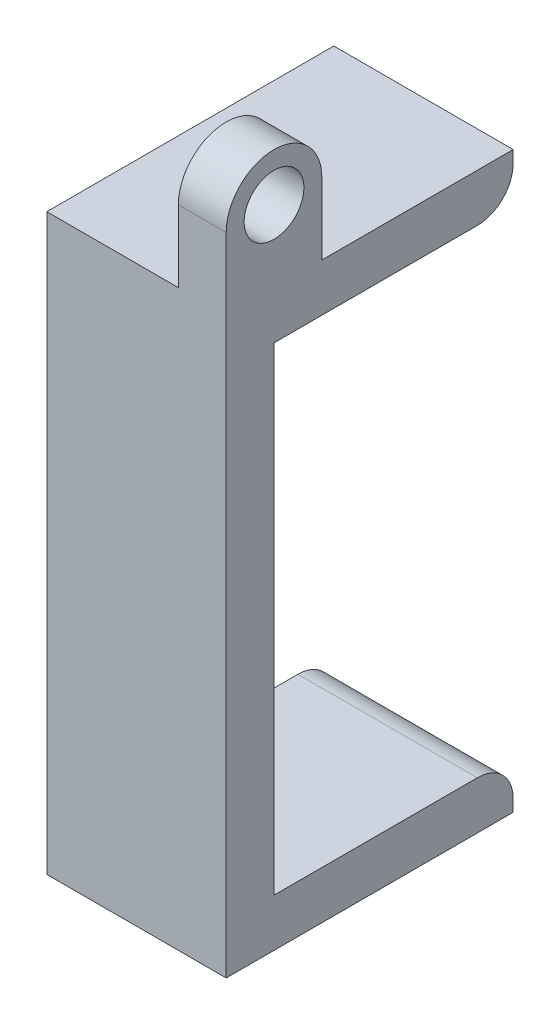
ISO-10303-21;
HEADER;
FILE_DESCRIPTION(('STEP AP214'),'2;1');
FILE_NAME('part.step','',(''),(''),'','','');
FILE_SCHEMA(('AUTOMOTIVE_DESIGN { 1 0 10303 214 1 1 1 1 }'));
ENDSEC;
DATA;
#1=APPLICATION_CONTEXT('core data for automotive mechanical design processes');
#2=APPLICATION_PROTOCOL_DEFINITION('international standard','automotive_design',2000,#1);
#3=PRODUCT_CONTEXT('',#1,'mechanical');
#4=PRODUCT('Part','Part','',(#3));
#5=PRODUCT_RELATED_PRODUCT_CATEGORY('part','',(#4));
#6=PRODUCT_DEFINITION_FORMATION('','',#4);
#7=PRODUCT_DEFINITION_CONTEXT('part definition',#1,'design');
#8=PRODUCT_DEFINITION('design','',#6,#7);
#9=PRODUCT_DEFINITION_SHAPE('','',#8);
#10=(LENGTH_UNIT() NAMED_UNIT(*) SI_UNIT(.MILLI.,.METRE.));
#11=(NAMED_UNIT(*) PLANE_ANGLE_UNIT() SI_UNIT($,.RADIAN.));
#12=(NAMED_UNIT(*) SI_UNIT($,.STERADIAN.) SOLID_ANGLE_UNIT());
#13=UNCERTAINTY_MEASURE_WITH_UNIT(LENGTH_MEASURE(1.E-05),#10,'distance_accuracy_value','');
#14=(GEOMETRIC_REPRESENTATION_CONTEXT(3) GLOBAL_UNCERTAINTY_ASSIGNED_CONTEXT((#13)) GLOBAL_UNIT_ASSIGNED_CONTEXT((#10,
#11,#12)) REPRESENTATION_CONTEXT('',''));
#15=CARTESIAN_POINT('',(0.,0.,0.));
#16=DIRECTION('',(0.,0.,1.));
#17=DIRECTION('',(1.,0.,0.));
#18=AXIS2_PLACEMENT_3D('',#15,#16,#17);
#19=CARTESIAN_POINT('',(-11.,-4.99999999999998,-20.));
#20=DIRECTION('',(0.,0.,-1.));
#21=DIRECTION('',(0.,1.,0.));
#22=AXIS2_PLACEMENT_3D('',#19,#20,#21);
#23=PLANE('',#22);
#24=DIRECTION('',(0.,1.,0.));
#25=VECTOR('',#24,1.);
#26=CARTESIAN_POINT('',(-11.,-4.99999999999998,-20.));
#27=LINE('',#26,#25);
#28=CARTESIAN_POINT('',(-11.,-53.,-20.));
#29=VERTEX_POINT('',#28);
#30=CARTESIAN_POINT('',(-11.,-52.,-20.));
#31=VERTEX_POINT('',#30);
#32=EDGE_CURVE('E163',#29,#31,#27,.T.);
#33=ORIENTED_EDGE('',*,*,#32,.T.);
#34=DIRECTION('',(-1.,0.,0.));
#35=VECTOR('',#34,1.);
#36=CARTESIAN_POINT('',(4.,-52.,-20.));
#37=LINE('',#36,#35);
#38=CARTESIAN_POINT('',(4.,-52.,-20.));
#39=VERTEX_POINT('',#38);
#40=EDGE_CURVE('E226',#31,#39,#37,.F.);
#41=ORIENTED_EDGE('',*,*,#40,.T.);
#42=DIRECTION('',(0.,1.,0.));
#43=VECTOR('',#42,1.);
#44=CARTESIAN_POINT('',(4.,-4.99999999999998,-20.));
#45=LINE('',#44,#43);
#46=CARTESIAN_POINT('',(4.,-53.,-20.));
#47=VERTEX_POINT('',#46);
#48=EDGE_CURVE('E175',#47,#39,#45,.T.);
#49=ORIENTED_EDGE('',*,*,#48,.F.);
#50=DIRECTION('',(1.,0.,0.));
#51=VECTOR('',#50,1.);
#52=CARTESIAN_POINT('',(-11.,-53.,-20.));
#53=LINE('',#52,#51);
#54=EDGE_CURVE('E247',#29,#47,#53,.T.);
#55=ORIENTED_EDGE('',*,*,#54,.F.);
#56=EDGE_LOOP('',(#33,#41,#49,#55));
#57=FACE_BOUND('',#56,.T.);
#58=ADVANCED_FACE('F33',(#57),#23,.T.);
#59=CARTESIAN_POINT('',(4.,1.00000000000002,0.));
#60=DIRECTION('',(-1.,0.,0.));
#61=DIRECTION('',(0.,0.,1.));
#62=AXIS2_PLACEMENT_3D('',#59,#60,#61);
#63=CYLINDRICAL_SURFACE('',#62,4.);
#64=CARTESIAN_POINT('',(0.,1.00000000000002,0.));
#65=DIRECTION('',(1.,0.,0.));
#66=DIRECTION('',(0.,0.,-1.));
#67=AXIS2_PLACEMENT_3D('',#64,#65,#66);
#68=CIRCLE('',#67,4.);
#69=CARTESIAN_POINT('',(0.,1.00000000000002,-3.99999999999999));
#70=VERTEX_POINT('',#69);
#71=CARTESIAN_POINT('',(0.,1.00000000000002,4.00000000000001));
#72=VERTEX_POINT('',#71);
#73=EDGE_CURVE('E202',#70,#72,#68,.T.);
#74=ORIENTED_EDGE('',*,*,#73,.T.);
#75=DIRECTION('',(-1.,0.,0.));
#76=VECTOR('',#75,1.);
#77=CARTESIAN_POINT('',(4.,1.00000000000002,4.00000000000001));
#78=LINE('',#77,#76);
#79=CARTESIAN_POINT('',(4.,1.00000000000002,4.00000000000001));
#80=VERTEX_POINT('',#79);
#81=EDGE_CURVE('E222',#80,#72,#78,.T.);
#82=ORIENTED_EDGE('',*,*,#81,.F.);
#83=CARTESIAN_POINT('',(4.,1.00000000000002,0.));
#84=DIRECTION('',(1.,0.,0.));
#85=DIRECTION('',(0.,0.,-1.));
#86=AXIS2_PLACEMENT_3D('',#83,#84,#85);
#87=CIRCLE('',#86,4.);
#88=CARTESIAN_POINT('',(4.,1.00000000000002,-3.99999999999999));
#89=VERTEX_POINT('',#88);
#90=EDGE_CURVE('E193',#89,#80,#87,.T.);
#91=ORIENTED_EDGE('',*,*,#90,.F.);
#92=DIRECTION('',(-1.,0.,0.));
#93=VECTOR('',#92,1.);
#94=CARTESIAN_POINT('',(4.,1.00000000000002,-3.99999999999999));
#95=LINE('',#94,#93);
#96=EDGE_CURVE('E267',#89,#70,#95,.T.);
#97=ORIENTED_EDGE('',*,*,#96,.T.);
#98=EDGE_LOOP('',(#74,#82,#91,#97));
#99=FACE_BOUND('',#98,.T.);
#100=ADVANCED_FACE('F262',(#99),#63,.T.);
#101=CARTESIAN_POINT('',(4.,0.,4.00000000000001));
#102=DIRECTION('',(0.,0.,1.));
#103=DIRECTION('',(1.,0.,0.));
#104=AXIS2_PLACEMENT_3D('',#101,#102,#103);
#105=PLANE('',#104);
#106=DIRECTION('',(0.,1.,0.));
#107=VECTOR('',#106,1.);
#108=CARTESIAN_POINT('',(0.,0.,4.00000000000001));
#109=LINE('',#108,#107);
#110=CARTESIAN_POINT('',(0.,-4.99999999999998,4.00000000000001));
#111=VERTEX_POINT('',#110);
#112=EDGE_CURVE('E205',#111,#72,#109,.T.);
#113=ORIENTED_EDGE('',*,*,#112,.F.);
#114=DIRECTION('',(1.,0.,0.));
#115=VECTOR('',#114,1.);
#116=CARTESIAN_POINT('',(-11.,-4.99999999999998,4.00000000000001));
#117=LINE('',#116,#115);
#118=CARTESIAN_POINT('',(-11.,-4.99999999999998,4.00000000000001));
#119=VERTEX_POINT('',#118);
#120=EDGE_CURVE('E186',#119,#111,#117,.T.);
#121=ORIENTED_EDGE('',*,*,#120,.F.);
#122=DIRECTION('',(0.,-1.,0.));
#123=VECTOR('',#122,1.);
#124=CARTESIAN_POINT('',(-11.,-4.99999999999998,4.00000000000001));
#125=LINE('',#124,#123);
#126=CARTESIAN_POINT('',(-11.,-53.,4.));
#127=VERTEX_POINT('',#126);
#128=EDGE_CURVE('E155',#119,#127,#125,.T.);
#129=ORIENTED_EDGE('',*,*,#128,.T.);
#130=DIRECTION('',(1.,0.,0.));
#131=VECTOR('',#130,1.);
#132=CARTESIAN_POINT('',(-11.,-53.,4.));
#133=LINE('',#132,#131);
#134=CARTESIAN_POINT('',(4.,-53.,4.));
#135=VERTEX_POINT('',#134);
#136=EDGE_CURVE('E169',#127,#135,#133,.T.);
#137=ORIENTED_EDGE('',*,*,#136,.T.);
#138=DIRECTION('',(0.,1.,0.));
#139=VECTOR('',#138,1.);
#140=CARTESIAN_POINT('',(4.,0.,4.00000000000001));
#141=LINE('',#140,#139);
#142=EDGE_CURVE('E196',#135,#80,#141,.T.);
#143=ORIENTED_EDGE('',*,*,#142,.T.);
#144=ORIENTED_EDGE('',*,*,#81,.T.);
#145=EDGE_LOOP('',(#113,#121,#129,#137,#143,#144));
#146=FACE_BOUND('',#145,.T.);
#147=ADVANCED_FACE('F254',(#146),#105,.T.);
#148=CARTESIAN_POINT('',(4.,1.00000000000002,0.));
#149=DIRECTION('',(-1.,0.,0.));
#150=DIRECTION('',(0.,0.,1.));
#151=AXIS2_PLACEMENT_3D('',#148,#149,#150);
#152=CYLINDRICAL_SURFACE('',#151,2.5);
#153=CARTESIAN_POINT('',(4.,1.00000000000002,0.));
#154=DIRECTION('',(1.,0.,0.));
#155=DIRECTION('',(0.,0.,-1.));
#156=AXIS2_PLACEMENT_3D('',#153,#154,#155);
#157=CIRCLE('',#156,2.5);
#158=CARTESIAN_POINT('',(4.,1.00000000000002,-2.49999999999999));
#159=VERTEX_POINT('',#158);
#160=EDGE_CURVE('E190',#159,#159,#157,.T.);
#161=ORIENTED_EDGE('',*,*,#160,.T.);
#162=EDGE_LOOP('',(#161));
#163=FACE_BOUND('',#162,.T.);
#164=CARTESIAN_POINT('',(0.,1.00000000000002,0.));
#165=DIRECTION('',(1.,0.,0.));
#166=DIRECTION('',(0.,0.,-1.));
#167=AXIS2_PLACEMENT_3D('',#164,#165,#166);
#168=CIRCLE('',#167,2.5);
#169=CARTESIAN_POINT('',(0.,1.00000000000002,-2.49999999999999));
#170=VERTEX_POINT('',#169);
#171=EDGE_CURVE('E188',#170,#170,#168,.T.);
#172=ORIENTED_EDGE('',*,*,#171,.F.);
#173=EDGE_LOOP('',(#172));
#174=FACE_BOUND('',#173,.T.);
#175=ADVANCED_FACE('F277',(#163,#174),#152,.F.);
#176=CARTESIAN_POINT('',(4.,0.,-3.99999999999999));
#177=DIRECTION('',(0.,0.,1.));
#178=DIRECTION('',(1.,0.,0.));
#179=AXIS2_PLACEMENT_3D('',#176,#177,#178);
#180=PLANE('',#179);
#181=DIRECTION('',(0.,1.,0.));
#182=VECTOR('',#181,1.);
#183=CARTESIAN_POINT('',(0.,0.,-3.99999999999999));
#184=LINE('',#183,#182);
#185=CARTESIAN_POINT('',(0.,-4.99999999999998,-3.99999999999999));
#186=VERTEX_POINT('',#185);
#187=EDGE_CURVE('E194',#186,#70,#184,.T.);
#188=ORIENTED_EDGE('',*,*,#187,.T.);
#189=ORIENTED_EDGE('',*,*,#96,.F.);
#190=DIRECTION('',(0.,1.,0.));
#191=VECTOR('',#190,1.);
#192=CARTESIAN_POINT('',(4.,0.,-3.99999999999999));
#193=LINE('',#192,#191);
#194=CARTESIAN_POINT('',(4.,-4.99999999999998,-3.99999999999999));
#195=VERTEX_POINT('',#194);
#196=EDGE_CURVE('E199',#195,#89,#193,.T.);
#197=ORIENTED_EDGE('',*,*,#196,.F.);
#198=DIRECTION('',(-1.,0.,0.));
#199=VECTOR('',#198,1.);
#200=CARTESIAN_POINT('',(4.,-4.99999999999998,-3.99999999999999));
#201=LINE('',#200,#199);
#202=EDGE_CURVE('E264',#195,#186,#201,.T.);
#203=ORIENTED_EDGE('',*,*,#202,.T.);
#204=EDGE_LOOP('',(#188,#189,#197,#203));
#205=FACE_BOUND('',#204,.T.);
#206=ADVANCED_FACE('F275',(#205),#180,.F.);
#207=CARTESIAN_POINT('',(4.,0.,0.));
#208=DIRECTION('',(1.,0.,0.));
#209=DIRECTION('',(0.,0.,-1.));
#210=AXIS2_PLACEMENT_3D('',#207,#208,#209);
#211=PLANE('',#210);
#212=ORIENTED_EDGE('',*,*,#48,.T.);
#213=CARTESIAN_POINT('',(4.,-52.,-17.));
#214=DIRECTION('',(1.,0.,0.));
#215=DIRECTION('',(0.,0.,-1.));
#216=AXIS2_PLACEMENT_3D('',#213,#214,#215);
#217=CIRCLE('',#216,3.);
#218=CARTESIAN_POINT('',(4.,-49.,-17.));
#219=VERTEX_POINT('',#218);
#220=EDGE_CURVE('E133',#39,#219,#217,.T.);
#221=ORIENTED_EDGE('',*,*,#220,.T.);
#222=DIRECTION('',(0.,0.,1.));
#223=VECTOR('',#222,1.);
#224=CARTESIAN_POINT('',(4.,-49.,-20.));
#225=LINE('',#224,#223);
#226=CARTESIAN_POINT('',(4.,-49.,0.));
#227=VERTEX_POINT('',#226);
#228=EDGE_CURVE('E126',#219,#227,#225,.T.);
#229=ORIENTED_EDGE('',*,*,#228,.T.);
#230=DIRECTION('',(0.,1.,0.));
#231=VECTOR('',#230,1.);
#232=CARTESIAN_POINT('',(4.,-8.99999999999998,0.));
#233=LINE('',#232,#231);
#234=CARTESIAN_POINT('',(4.,-8.99999999999998,0.));
#235=VERTEX_POINT('',#234);
#236=EDGE_CURVE('E131',#227,#235,#233,.T.);
#237=ORIENTED_EDGE('',*,*,#236,.T.);
#238=DIRECTION('',(0.,0.,-1.));
#239=VECTOR('',#238,1.);
#240=CARTESIAN_POINT('',(4.,-8.99999999999998,-20.));
#241=LINE('',#240,#239);
#242=CARTESIAN_POINT('',(4.,-8.99999999999998,-17.));
#243=VERTEX_POINT('',#242);
#244=EDGE_CURVE('E174',#235,#243,#241,.T.);
#245=ORIENTED_EDGE('',*,*,#244,.T.);
#246=CARTESIAN_POINT('',(4.,-5.99999999999998,-17.));
#247=DIRECTION('',(1.,0.,0.));
#248=DIRECTION('',(0.,0.,-1.));
#249=AXIS2_PLACEMENT_3D('',#246,#247,#248);
#250=CIRCLE('',#249,3.);
#251=CARTESIAN_POINT('',(4.,-5.99999999999998,-20.));
#252=VERTEX_POINT('',#251);
#253=EDGE_CURVE('E48',#243,#252,#250,.T.);
#254=ORIENTED_EDGE('',*,*,#253,.T.);
#255=CARTESIAN_POINT('',(4.,-4.99999999999998,-20.));
#256=VERTEX_POINT('',#255);
#257=EDGE_CURVE('E173',#252,#256,#45,.T.);
#258=ORIENTED_EDGE('',*,*,#257,.T.);
#259=DIRECTION('',(0.,0.,1.));
#260=VECTOR('',#259,1.);
#261=CARTESIAN_POINT('',(4.,-4.99999999999998,4.00000000000001));
#262=LINE('',#261,#260);
#263=EDGE_CURVE('E159',#256,#195,#262,.T.);
#264=ORIENTED_EDGE('',*,*,#263,.T.);
#265=ORIENTED_EDGE('',*,*,#196,.T.);
#266=ORIENTED_EDGE('',*,*,#90,.T.);
#267=ORIENTED_EDGE('',*,*,#142,.F.);
#268=DIRECTION('',(0.,0.,-1.));
#269=VECTOR('',#268,1.);
#270=CARTESIAN_POINT('',(4.,-53.,4.));
#271=LINE('',#270,#269);
#272=EDGE_CURVE('E170',#135,#47,#271,.T.);
#273=ORIENTED_EDGE('',*,*,#272,.T.);
#274=EDGE_LOOP('',(#212,#221,#229,#237,#245,#254,#258,#264,#265,#266,#267,#273));
#275=FACE_BOUND('',#274,.T.);
#276=ORIENTED_EDGE('',*,*,#160,.F.);
#277=EDGE_LOOP('',(#276));
#278=FACE_BOUND('',#277,.T.);
#279=ADVANCED_FACE('F129',(#275,#278),#211,.T.);
#280=CARTESIAN_POINT('',(0.,0.,0.));
#281=DIRECTION('',(1.,0.,0.));
#282=DIRECTION('',(0.,0.,-1.));
#283=AXIS2_PLACEMENT_3D('',#280,#281,#282);
#284=PLANE('',#283);
#285=ORIENTED_EDGE('',*,*,#171,.T.);
#286=EDGE_LOOP('',(#285));
#287=FACE_BOUND('',#286,.T.);
#288=ORIENTED_EDGE('',*,*,#73,.F.);
#289=ORIENTED_EDGE('',*,*,#187,.F.);
#290=DIRECTION('',(0.,0.,-1.));
#291=VECTOR('',#290,1.);
#292=CARTESIAN_POINT('',(0.,-4.99999999999998,0.));
#293=LINE('',#292,#291);
#294=EDGE_CURVE('E210',#111,#186,#293,.T.);
#295=ORIENTED_EDGE('',*,*,#294,.F.);
#296=ORIENTED_EDGE('',*,*,#112,.T.);
#297=EDGE_LOOP('',(#288,#289,#295,#296));
#298=FACE_BOUND('',#297,.T.);
#299=ADVANCED_FACE('F274',(#287,#298),#284,.F.);
#300=CARTESIAN_POINT('',(-11.,-4.99999999999998,4.00000000000001));
#301=DIRECTION('',(0.,1.,0.));
#302=DIRECTION('',(0.,0.,1.));
#303=AXIS2_PLACEMENT_3D('',#300,#301,#302);
#304=PLANE('',#303);
#305=ORIENTED_EDGE('',*,*,#120,.T.);
#306=ORIENTED_EDGE('',*,*,#294,.T.);
#307=ORIENTED_EDGE('',*,*,#202,.F.);
#308=ORIENTED_EDGE('',*,*,#263,.F.);
#309=DIRECTION('',(1.,0.,0.));
#310=VECTOR('',#309,1.);
#311=CARTESIAN_POINT('',(-11.,-4.99999999999998,-20.));
#312=LINE('',#311,#310);
#313=CARTESIAN_POINT('',(-11.,-4.99999999999998,-20.));
#314=VERTEX_POINT('',#313);
#315=EDGE_CURVE('E189',#314,#256,#312,.T.);
#316=ORIENTED_EDGE('',*,*,#315,.F.);
#317=DIRECTION('',(0.,0.,1.));
#318=VECTOR('',#317,1.);
#319=CARTESIAN_POINT('',(-11.,-4.99999999999998,4.00000000000001));
#320=LINE('',#319,#318);
#321=EDGE_CURVE('E166',#314,#119,#320,.T.);
#322=ORIENTED_EDGE('',*,*,#321,.T.);
#323=EDGE_LOOP('',(#305,#306,#307,#308,#316,#322));
#324=FACE_BOUND('',#323,.T.);
#325=ADVANCED_FACE('F244',(#324),#304,.T.);
#326=ORIENTED_EDGE('',*,*,#257,.F.);
#327=DIRECTION('',(-1.,0.,0.));
#328=VECTOR('',#327,1.);
#329=CARTESIAN_POINT('',(-11.,-5.99999999999998,-20.));
#330=LINE('',#329,#328);
#331=CARTESIAN_POINT('',(-11.,-5.99999999999998,-20.));
#332=VERTEX_POINT('',#331);
#333=EDGE_CURVE('E41',#252,#332,#330,.T.);
#334=ORIENTED_EDGE('',*,*,#333,.T.);
#335=EDGE_CURVE('E162',#332,#314,#27,.T.);
#336=ORIENTED_EDGE('',*,*,#335,.T.);
#337=ORIENTED_EDGE('',*,*,#315,.T.);
#338=EDGE_LOOP('',(#326,#334,#336,#337));
#339=FACE_BOUND('',#338,.T.);
#340=ADVANCED_FACE('F233',(#339),#23,.T.);
#341=CARTESIAN_POINT('',(-11.,-53.,4.));
#342=DIRECTION('',(0.,-1.,0.));
#343=DIRECTION('',(0.,0.,-1.));
#344=AXIS2_PLACEMENT_3D('',#341,#342,#343);
#345=PLANE('',#344);
#346=ORIENTED_EDGE('',*,*,#272,.F.);
#347=ORIENTED_EDGE('',*,*,#136,.F.);
#348=DIRECTION('',(0.,0.,-1.));
#349=VECTOR('',#348,1.);
#350=CARTESIAN_POINT('',(-11.,-53.,4.));
#351=LINE('',#350,#349);
#352=EDGE_CURVE('E158',#127,#29,#351,.T.);
#353=ORIENTED_EDGE('',*,*,#352,.T.);
#354=ORIENTED_EDGE('',*,*,#54,.T.);
#355=EDGE_LOOP('',(#346,#347,#353,#354));
#356=FACE_BOUND('',#355,.T.);
#357=ADVANCED_FACE('F255',(#356),#345,.T.);
#358=CARTESIAN_POINT('',(-11.,0.,0.));
#359=DIRECTION('',(1.,0.,0.));
#360=DIRECTION('',(0.,0.,-1.));
#361=AXIS2_PLACEMENT_3D('',#358,#359,#360);
#362=PLANE('',#361);
#363=DIRECTION('',(0.,0.,1.));
#364=VECTOR('',#363,1.);
#365=CARTESIAN_POINT('',(-11.,-49.,-20.));
#366=LINE('',#365,#364);
#367=CARTESIAN_POINT('',(-11.,-49.,-17.));
#368=VERTEX_POINT('',#367);
#369=CARTESIAN_POINT('',(-11.,-49.,0.));
#370=VERTEX_POINT('',#369);
#371=EDGE_CURVE('E151',#368,#370,#366,.T.);
#372=ORIENTED_EDGE('',*,*,#371,.F.);
#373=CARTESIAN_POINT('',(-11.,-52.,-17.));
#374=DIRECTION('',(1.,0.,0.));
#375=DIRECTION('',(0.,0.,-1.));
#376=AXIS2_PLACEMENT_3D('',#373,#374,#375);
#377=CIRCLE('',#376,3.);
#378=EDGE_CURVE('E224',#368,#31,#377,.F.);
#379=ORIENTED_EDGE('',*,*,#378,.T.);
#380=ORIENTED_EDGE('',*,*,#32,.F.);
#381=ORIENTED_EDGE('',*,*,#352,.F.);
#382=ORIENTED_EDGE('',*,*,#128,.F.);
#383=ORIENTED_EDGE('',*,*,#321,.F.);
#384=ORIENTED_EDGE('',*,*,#335,.F.);
#385=CARTESIAN_POINT('',(-11.,-5.99999999999998,-17.));
#386=DIRECTION('',(1.,0.,0.));
#387=DIRECTION('',(0.,0.,-1.));
#388=AXIS2_PLACEMENT_3D('',#385,#386,#387);
#389=CIRCLE('',#388,3.);
#390=CARTESIAN_POINT('',(-11.,-8.99999999999998,-17.));
#391=VERTEX_POINT('',#390);
#392=EDGE_CURVE('E221',#332,#391,#389,.F.);
#393=ORIENTED_EDGE('',*,*,#392,.T.);
#394=DIRECTION('',(0.,0.,-1.));
#395=VECTOR('',#394,1.);
#396=CARTESIAN_POINT('',(-11.,-8.99999999999998,-20.));
#397=LINE('',#396,#395);
#398=CARTESIAN_POINT('',(-11.,-8.99999999999998,0.));
#399=VERTEX_POINT('',#398);
#400=EDGE_CURVE('E139',#399,#391,#397,.T.);
#401=ORIENTED_EDGE('',*,*,#400,.F.);
#402=DIRECTION('',(0.,1.,0.));
#403=VECTOR('',#402,1.);
#404=CARTESIAN_POINT('',(-11.,-8.99999999999998,0.));
#405=LINE('',#404,#403);
#406=EDGE_CURVE('E320',#370,#399,#405,.T.);
#407=ORIENTED_EDGE('',*,*,#406,.F.);
#408=EDGE_LOOP('',(#372,#379,#380,#381,#382,#383,#384,#393,#401,#407));
#409=FACE_BOUND('',#408,.T.);
#410=ADVANCED_FACE('F239',(#409),#362,.F.);
#411=CARTESIAN_POINT('',(48.7213595499958,-49.,-20.));
#412=DIRECTION('',(0.,-1.,0.));
#413=DIRECTION('',(0.,0.,-1.));
#414=AXIS2_PLACEMENT_3D('',#411,#412,#413);
#415=PLANE('',#414);
#416=ORIENTED_EDGE('',*,*,#228,.F.);
#417=DIRECTION('',(-1.,0.,0.));
#418=VECTOR('',#417,1.);
#419=CARTESIAN_POINT('',(-11.,-49.,-17.));
#420=LINE('',#419,#418);
#421=EDGE_CURVE('E219',#219,#368,#420,.T.);
#422=ORIENTED_EDGE('',*,*,#421,.T.);
#423=ORIENTED_EDGE('',*,*,#371,.T.);
#424=DIRECTION('',(-1.,0.,0.));
#425=VECTOR('',#424,1.);
#426=CARTESIAN_POINT('',(48.7213595499958,-49.,0.));
#427=LINE('',#426,#425);
#428=EDGE_CURVE('E138',#227,#370,#427,.T.);
#429=ORIENTED_EDGE('',*,*,#428,.F.);
#430=EDGE_LOOP('',(#416,#422,#423,#429));
#431=FACE_BOUND('',#430,.T.);
#432=ADVANCED_FACE('F149',(#431),#415,.F.);
#433=CARTESIAN_POINT('',(48.7213595499958,-8.99999999999998,0.));
#434=DIRECTION('',(0.,0.,1.));
#435=DIRECTION('',(0.,-1.,0.));
#436=AXIS2_PLACEMENT_3D('',#433,#434,#435);
#437=PLANE('',#436);
#438=ORIENTED_EDGE('',*,*,#428,.T.);
#439=ORIENTED_EDGE('',*,*,#406,.T.);
#440=DIRECTION('',(-1.,0.,0.));
#441=VECTOR('',#440,1.);
#442=CARTESIAN_POINT('',(48.7213595499958,-8.99999999999998,0.));
#443=LINE('',#442,#441);
#444=EDGE_CURVE('E147',#235,#399,#443,.T.);
#445=ORIENTED_EDGE('',*,*,#444,.F.);
#446=ORIENTED_EDGE('',*,*,#236,.F.);
#447=EDGE_LOOP('',(#438,#439,#445,#446));
#448=FACE_BOUND('',#447,.T.);
#449=ADVANCED_FACE('F144',(#448),#437,.F.);
#450=CARTESIAN_POINT('',(48.7213595499958,-8.99999999999998,-20.));
#451=DIRECTION('',(0.,1.,0.));
#452=DIRECTION('',(0.,0.,1.));
#453=AXIS2_PLACEMENT_3D('',#450,#451,#452);
#454=PLANE('',#453);
#455=ORIENTED_EDGE('',*,*,#400,.T.);
#456=DIRECTION('',(-1.,0.,0.));
#457=VECTOR('',#456,1.);
#458=CARTESIAN_POINT('',(4.,-8.99999999999998,-17.));
#459=LINE('',#458,#457);
#460=EDGE_CURVE('E11',#391,#243,#459,.F.);
#461=ORIENTED_EDGE('',*,*,#460,.T.);
#462=ORIENTED_EDGE('',*,*,#244,.F.);
#463=ORIENTED_EDGE('',*,*,#444,.T.);
#464=EDGE_LOOP('',(#455,#461,#462,#463));
#465=FACE_BOUND('',#464,.T.);
#466=ADVANCED_FACE('F313',(#465),#454,.F.);
#467=CARTESIAN_POINT('',(48.7213595499958,-52.,-17.));
#468=DIRECTION('',(1.,0.,0.));
#469=DIRECTION('',(0.,0.,-1.));
#470=AXIS2_PLACEMENT_3D('',#467,#468,#469);
#471=CYLINDRICAL_SURFACE('',#470,3.);
#472=ORIENTED_EDGE('',*,*,#220,.F.);
#473=ORIENTED_EDGE('',*,*,#40,.F.);
#474=ORIENTED_EDGE('',*,*,#378,.F.);
#475=ORIENTED_EDGE('',*,*,#421,.F.);
#476=EDGE_LOOP('',(#472,#473,#474,#475));
#477=FACE_BOUND('',#476,.T.);
#478=ADVANCED_FACE('F315',(#477),#471,.T.);
#479=CARTESIAN_POINT('',(-11.,-5.99999999999998,-17.));
#480=DIRECTION('',(1.,0.,0.));
#481=DIRECTION('',(0.,0.,-1.));
#482=AXIS2_PLACEMENT_3D('',#479,#480,#481);
#483=CYLINDRICAL_SURFACE('',#482,3.);
#484=ORIENTED_EDGE('',*,*,#253,.F.);
#485=ORIENTED_EDGE('',*,*,#460,.F.);
#486=ORIENTED_EDGE('',*,*,#392,.F.);
#487=ORIENTED_EDGE('',*,*,#333,.F.);
#488=EDGE_LOOP('',(#484,#485,#486,#487));
#489=FACE_BOUND('',#488,.T.);
#490=ADVANCED_FACE('F35',(#489),#483,.T.);
#491=CLOSED_SHELL('',(#58,#100,#147,#175,#206,#279,#299,#325,#340,#357,#410,#432,#449,#466,#478,#490));
#492=MANIFOLD_SOLID_BREP('B2',#491);
#493=ADVANCED_BREP_SHAPE_REPRESENTATION('',(#18,#492),#14);
#494=SHAPE_DEFINITION_REPRESENTATION(#9,#493);
ENDSEC;
END-ISO-10303-21;
